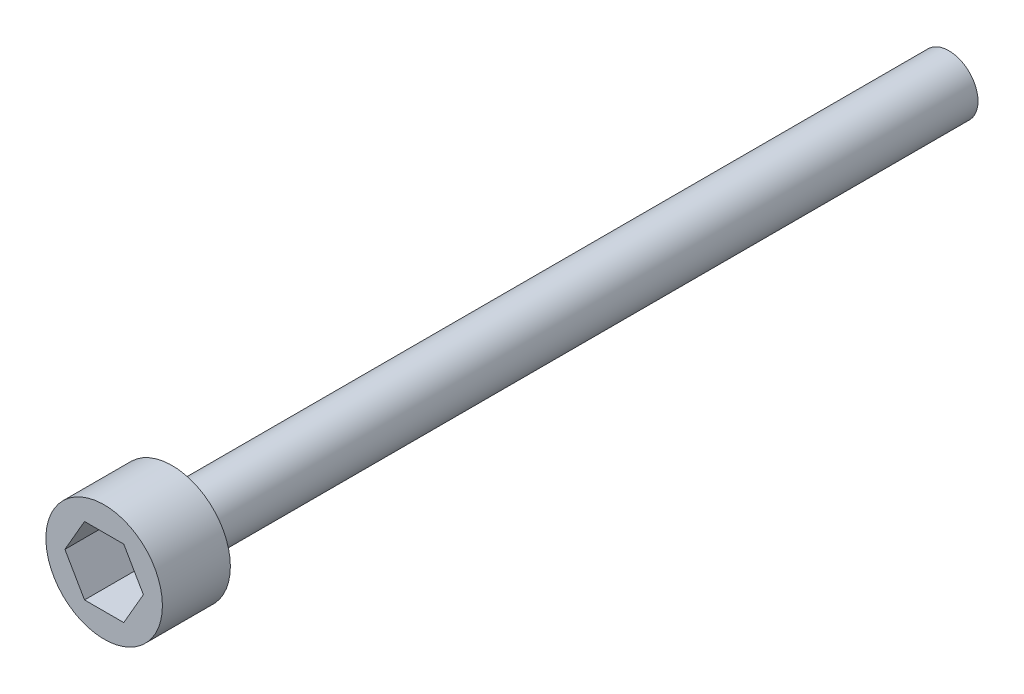
ISO-10303-21;
HEADER;
FILE_DESCRIPTION(('STEP AP214'),'2;1');
FILE_NAME('part.step','',(''),(''),'','','');
FILE_SCHEMA(('AUTOMOTIVE_DESIGN { 1 0 10303 214 1 1 1 1 }'));
ENDSEC;
DATA;
#1=APPLICATION_CONTEXT('core data for automotive mechanical design processes');
#2=APPLICATION_PROTOCOL_DEFINITION('international standard','automotive_design',2000,#1);
#3=PRODUCT_CONTEXT('',#1,'mechanical');
#4=PRODUCT('Part','Part','',(#3));
#5=PRODUCT_RELATED_PRODUCT_CATEGORY('part','',(#4));
#6=PRODUCT_DEFINITION_FORMATION('','',#4);
#7=PRODUCT_DEFINITION_CONTEXT('part definition',#1,'design');
#8=PRODUCT_DEFINITION('design','',#6,#7);
#9=PRODUCT_DEFINITION_SHAPE('','',#8);
#10=(LENGTH_UNIT() NAMED_UNIT(*) SI_UNIT(.MILLI.,.METRE.));
#11=(NAMED_UNIT(*) PLANE_ANGLE_UNIT() SI_UNIT($,.RADIAN.));
#12=(NAMED_UNIT(*) SI_UNIT($,.STERADIAN.) SOLID_ANGLE_UNIT());
#13=UNCERTAINTY_MEASURE_WITH_UNIT(LENGTH_MEASURE(1.E-05),#10,'distance_accuracy_value','');
#14=(GEOMETRIC_REPRESENTATION_CONTEXT(3) GLOBAL_UNCERTAINTY_ASSIGNED_CONTEXT((#13)) GLOBAL_UNIT_ASSIGNED_CONTEXT((#10,
#11,#12)) REPRESENTATION_CONTEXT('',''));
#15=CARTESIAN_POINT('',(0.,0.,0.));
#16=DIRECTION('',(0.,0.,1.));
#17=DIRECTION('',(1.,0.,0.));
#18=AXIS2_PLACEMENT_3D('',#15,#16,#17);
#19=CARTESIAN_POINT('',(0.,0.,3.5));
#20=DIRECTION('',(0.,0.,-1.));
#21=DIRECTION('',(-1.,0.,0.));
#22=AXIS2_PLACEMENT_3D('',#19,#20,#21);
#23=CYLINDRICAL_SURFACE('',#22,3.);
#24=CARTESIAN_POINT('',(0.,0.,3.5));
#25=DIRECTION('',(0.,0.,1.));
#26=DIRECTION('',(1.,0.,0.));
#27=AXIS2_PLACEMENT_3D('',#24,#25,#26);
#28=CIRCLE('',#27,3.);
#29=CARTESIAN_POINT('',(3.,0.,3.5));
#30=VERTEX_POINT('',#29);
#31=EDGE_CURVE('E11',#30,#30,#28,.T.);
#32=ORIENTED_EDGE('',*,*,#31,.F.);
#33=EDGE_LOOP('',(#32));
#34=FACE_BOUND('',#33,.T.);
#35=CARTESIAN_POINT('',(0.,0.,0.));
#36=DIRECTION('',(0.,0.,1.));
#37=DIRECTION('',(1.,0.,0.));
#38=AXIS2_PLACEMENT_3D('',#35,#36,#37);
#39=CIRCLE('',#38,3.);
#40=CARTESIAN_POINT('',(3.,0.,0.));
#41=VERTEX_POINT('',#40);
#42=EDGE_CURVE('E38',#41,#41,#39,.T.);
#43=ORIENTED_EDGE('',*,*,#42,.T.);
#44=EDGE_LOOP('',(#43));
#45=FACE_BOUND('',#44,.T.);
#46=ADVANCED_FACE('F35',(#34,#45),#23,.T.);
#47=CARTESIAN_POINT('',(0.,0.,3.5));
#48=DIRECTION('',(0.,0.,1.));
#49=DIRECTION('',(1.,0.,0.));
#50=AXIS2_PLACEMENT_3D('',#47,#48,#49);
#51=PLANE('',#50);
#52=DIRECTION('',(-0.499999999999528,-0.866025403784711,0.));
#53=VECTOR('',#52,1.);
#54=CARTESIAN_POINT('',(-2.02072594216261,2.1557411053031E-12,3.5));
#55=LINE('',#54,#53);
#56=CARTESIAN_POINT('',(-1.01036297108294,1.75000000000058,3.5));
#57=VERTEX_POINT('',#56);
#58=CARTESIAN_POINT('',(-2.02072594216261,2.15561075933568E-12,3.5));
#59=VERTEX_POINT('',#58);
#60=EDGE_CURVE('E49',#57,#59,#55,.T.);
#61=ORIENTED_EDGE('',*,*,#60,.F.);
#62=DIRECTION('',(-1.,-7.11024037944377E-13,0.));
#63=VECTOR('',#62,1.);
#64=CARTESIAN_POINT('',(-1.01036297108294,1.75000000000058,3.5));
#65=LINE('',#64,#63);
#66=CARTESIAN_POINT('',(1.01036297108301,1.75000000000202,3.5));
#67=VERTEX_POINT('',#66);
#68=EDGE_CURVE('E133',#67,#57,#65,.T.);
#69=ORIENTED_EDGE('',*,*,#68,.F.);
#70=DIRECTION('',(-0.50000000000043,0.86602540378419,0.));
#71=VECTOR('',#70,1.);
#72=CARTESIAN_POINT('',(1.01036297108301,1.75000000000202,3.5));
#73=LINE('',#72,#71);
#74=CARTESIAN_POINT('',(2.02072594216593,2.15574110530311E-12,3.5));
#75=VERTEX_POINT('',#74);
#76=EDGE_CURVE('E131',#75,#67,#73,.T.);
#77=ORIENTED_EDGE('',*,*,#76,.F.);
#78=DIRECTION('',(0.499999999999527,0.866025403784711,0.));
#79=VECTOR('',#78,1.);
#80=CARTESIAN_POINT('',(2.02072594216593,2.15574110530311E-12,3.5));
#81=LINE('',#80,#79);
#82=CARTESIAN_POINT('',(1.01036297108301,-1.75000000000192,3.5));
#83=VERTEX_POINT('',#82);
#84=EDGE_CURVE('E97',#83,#75,#81,.T.);
#85=ORIENTED_EDGE('',*,*,#84,.F.);
#86=DIRECTION('',(1.,7.11024037946673E-13,0.));
#87=VECTOR('',#86,1.);
#88=CARTESIAN_POINT('',(1.01036297108301,-1.75000000000192,3.5));
#89=LINE('',#88,#87);
#90=CARTESIAN_POINT('',(-1.01036297107642,-1.75000000000336,3.5));
#91=VERTEX_POINT('',#90);
#92=EDGE_CURVE('E127',#91,#83,#89,.T.);
#93=ORIENTED_EDGE('',*,*,#92,.F.);
#94=DIRECTION('',(0.500000000000431,-0.86602540378419,0.));
#95=VECTOR('',#94,1.);
#96=CARTESIAN_POINT('',(-1.01036297107642,-1.75000000000336,3.5));
#97=LINE('',#96,#95);
#98=EDGE_CURVE('E123',#59,#91,#97,.T.);
#99=ORIENTED_EDGE('',*,*,#98,.F.);
#100=EDGE_LOOP('',(#61,#69,#77,#85,#93,#99));
#101=FACE_BOUND('',#100,.T.);
#102=ORIENTED_EDGE('',*,*,#31,.T.);
#103=EDGE_LOOP('',(#102));
#104=FACE_BOUND('',#103,.T.);
#105=ADVANCED_FACE('F146',(#101,#104),#51,.T.);
#106=CARTESIAN_POINT('',(0.,0.,0.));
#107=DIRECTION('',(0.,0.,1.));
#108=DIRECTION('',(1.,0.,0.));
#109=AXIS2_PLACEMENT_3D('',#106,#107,#108);
#110=PLANE('',#109);
#111=CARTESIAN_POINT('',(0.,0.,0.));
#112=DIRECTION('',(0.,0.,1.));
#113=DIRECTION('',(1.,0.,0.));
#114=AXIS2_PLACEMENT_3D('',#111,#112,#113);
#115=CIRCLE('',#114,1.5);
#116=CARTESIAN_POINT('',(1.5,0.,0.));
#117=VERTEX_POINT('',#116);
#118=EDGE_CURVE('E153',#117,#117,#115,.T.);
#119=ORIENTED_EDGE('',*,*,#118,.T.);
#120=EDGE_LOOP('',(#119));
#121=FACE_BOUND('',#120,.T.);
#122=ORIENTED_EDGE('',*,*,#42,.F.);
#123=EDGE_LOOP('',(#122));
#124=FACE_BOUND('',#123,.T.);
#125=ADVANCED_FACE('F174',(#121,#124),#110,.F.);
#126=CARTESIAN_POINT('',(-2.02072594216261,2.1557411053031E-12,0.7));
#127=DIRECTION('',(-0.866025403784711,0.499999999999528,0.));
#128=DIRECTION('',(-0.499999999999528,-0.866025403784711,0.));
#129=AXIS2_PLACEMENT_3D('',#126,#127,#128);
#130=PLANE('',#129);
#131=ORIENTED_EDGE('',*,*,#60,.T.);
#132=DIRECTION('',(0.,0.,1.));
#133=VECTOR('',#132,1.);
#134=CARTESIAN_POINT('',(-2.02072594216261,2.1557411053031E-12,0.7));
#135=LINE('',#134,#133);
#136=CARTESIAN_POINT('',(-2.02072594216261,2.1557411053031E-12,0.7));
#137=VERTEX_POINT('',#136);
#138=EDGE_CURVE('E79',#137,#59,#135,.T.);
#139=ORIENTED_EDGE('',*,*,#138,.F.);
#140=DIRECTION('',(-0.499999999999528,-0.866025403784711,0.));
#141=VECTOR('',#140,1.);
#142=CARTESIAN_POINT('',(-2.02072594216261,2.1557411053031E-12,0.7));
#143=LINE('',#142,#141);
#144=CARTESIAN_POINT('',(-1.01036297108294,1.75000000000058,0.7));
#145=VERTEX_POINT('',#144);
#146=EDGE_CURVE('E135',#145,#137,#143,.T.);
#147=ORIENTED_EDGE('',*,*,#146,.F.);
#148=DIRECTION('',(0.,0.,1.));
#149=VECTOR('',#148,1.);
#150=CARTESIAN_POINT('',(-1.01036297108294,1.75000000000058,0.7));
#151=LINE('',#150,#149);
#152=EDGE_CURVE('E57',#145,#57,#151,.T.);
#153=ORIENTED_EDGE('',*,*,#152,.T.);
#154=EDGE_LOOP('',(#131,#139,#147,#153));
#155=FACE_BOUND('',#154,.T.);
#156=ADVANCED_FACE('F182',(#155),#130,.F.);
#157=CARTESIAN_POINT('',(-1.01036297108294,1.75000000000058,0.7));
#158=DIRECTION('',(-7.11024037944377E-13,1.,0.));
#159=DIRECTION('',(-1.,-7.11024037944377E-13,0.));
#160=AXIS2_PLACEMENT_3D('',#157,#158,#159);
#161=PLANE('',#160);
#162=ORIENTED_EDGE('',*,*,#68,.T.);
#163=ORIENTED_EDGE('',*,*,#152,.F.);
#164=DIRECTION('',(-1.,-7.11024037944377E-13,0.));
#165=VECTOR('',#164,1.);
#166=CARTESIAN_POINT('',(-1.01036297108294,1.75000000000058,0.7));
#167=LINE('',#166,#165);
#168=CARTESIAN_POINT('',(1.01036297108301,1.75000000000202,0.7));
#169=VERTEX_POINT('',#168);
#170=EDGE_CURVE('E109',#169,#145,#167,.T.);
#171=ORIENTED_EDGE('',*,*,#170,.F.);
#172=DIRECTION('',(0.,0.,1.));
#173=VECTOR('',#172,1.);
#174=CARTESIAN_POINT('',(1.01036297108301,1.75000000000202,0.7));
#175=LINE('',#174,#173);
#176=EDGE_CURVE('E101',#169,#67,#175,.T.);
#177=ORIENTED_EDGE('',*,*,#176,.T.);
#178=EDGE_LOOP('',(#162,#163,#171,#177));
#179=FACE_BOUND('',#178,.T.);
#180=ADVANCED_FACE('F187',(#179),#161,.F.);
#181=CARTESIAN_POINT('',(1.01036297108301,1.75000000000202,0.7));
#182=DIRECTION('',(0.86602540378419,0.50000000000043,0.));
#183=DIRECTION('',(-0.50000000000043,0.86602540378419,0.));
#184=AXIS2_PLACEMENT_3D('',#181,#182,#183);
#185=PLANE('',#184);
#186=ORIENTED_EDGE('',*,*,#76,.T.);
#187=ORIENTED_EDGE('',*,*,#176,.F.);
#188=DIRECTION('',(-0.50000000000043,0.86602540378419,0.));
#189=VECTOR('',#188,1.);
#190=CARTESIAN_POINT('',(1.01036297108301,1.75000000000202,0.7));
#191=LINE('',#190,#189);
#192=CARTESIAN_POINT('',(2.02072594216593,2.15574110530311E-12,0.7));
#193=VERTEX_POINT('',#192);
#194=EDGE_CURVE('E105',#193,#169,#191,.T.);
#195=ORIENTED_EDGE('',*,*,#194,.F.);
#196=DIRECTION('',(0.,0.,1.));
#197=VECTOR('',#196,1.);
#198=CARTESIAN_POINT('',(2.02072594216593,2.15574110530311E-12,0.7));
#199=LINE('',#198,#197);
#200=EDGE_CURVE('E90',#193,#75,#199,.T.);
#201=ORIENTED_EDGE('',*,*,#200,.T.);
#202=EDGE_LOOP('',(#186,#187,#195,#201));
#203=FACE_BOUND('',#202,.T.);
#204=ADVANCED_FACE('F106',(#203),#185,.F.);
#205=CARTESIAN_POINT('',(2.02072594216593,2.15574110530311E-12,0.7));
#206=DIRECTION('',(0.866025403784712,-0.499999999999527,0.));
#207=DIRECTION('',(0.499999999999527,0.866025403784712,0.));
#208=AXIS2_PLACEMENT_3D('',#205,#206,#207);
#209=PLANE('',#208);
#210=ORIENTED_EDGE('',*,*,#84,.T.);
#211=ORIENTED_EDGE('',*,*,#200,.F.);
#212=DIRECTION('',(0.499999999999527,0.866025403784711,0.));
#213=VECTOR('',#212,1.);
#214=CARTESIAN_POINT('',(2.02072594216593,2.15574110530311E-12,0.7));
#215=LINE('',#214,#213);
#216=CARTESIAN_POINT('',(1.01036297108301,-1.75000000000192,0.7));
#217=VERTEX_POINT('',#216);
#218=EDGE_CURVE('E94',#217,#193,#215,.T.);
#219=ORIENTED_EDGE('',*,*,#218,.F.);
#220=DIRECTION('',(0.,0.,1.));
#221=VECTOR('',#220,1.);
#222=CARTESIAN_POINT('',(1.01036297108301,-1.75000000000192,0.7));
#223=LINE('',#222,#221);
#224=EDGE_CURVE('E102',#217,#83,#223,.T.);
#225=ORIENTED_EDGE('',*,*,#224,.T.);
#226=EDGE_LOOP('',(#210,#211,#219,#225));
#227=FACE_BOUND('',#226,.T.);
#228=ADVANCED_FACE('F92',(#227),#209,.F.);
#229=CARTESIAN_POINT('',(1.01036297108301,-1.75000000000192,0.7));
#230=DIRECTION('',(7.11024037946673E-13,-1.,0.));
#231=DIRECTION('',(1.,7.11024037946673E-13,0.));
#232=AXIS2_PLACEMENT_3D('',#229,#230,#231);
#233=PLANE('',#232);
#234=ORIENTED_EDGE('',*,*,#92,.T.);
#235=ORIENTED_EDGE('',*,*,#224,.F.);
#236=DIRECTION('',(1.,7.11024037946673E-13,0.));
#237=VECTOR('',#236,1.);
#238=CARTESIAN_POINT('',(1.01036297108301,-1.75000000000192,0.7));
#239=LINE('',#238,#237);
#240=CARTESIAN_POINT('',(-1.01036297107642,-1.75000000000336,0.7));
#241=VERTEX_POINT('',#240);
#242=EDGE_CURVE('E115',#241,#217,#239,.T.);
#243=ORIENTED_EDGE('',*,*,#242,.F.);
#244=DIRECTION('',(0.,0.,1.));
#245=VECTOR('',#244,1.);
#246=CARTESIAN_POINT('',(-1.01036297107642,-1.75000000000336,0.7));
#247=LINE('',#246,#245);
#248=EDGE_CURVE('E139',#241,#91,#247,.T.);
#249=ORIENTED_EDGE('',*,*,#248,.T.);
#250=EDGE_LOOP('',(#234,#235,#243,#249));
#251=FACE_BOUND('',#250,.T.);
#252=ADVANCED_FACE('F150',(#251),#233,.F.);
#253=CARTESIAN_POINT('',(-1.01036297107642,-1.75000000000336,0.7));
#254=DIRECTION('',(-0.86602540378419,-0.500000000000431,0.));
#255=DIRECTION('',(0.500000000000431,-0.86602540378419,0.));
#256=AXIS2_PLACEMENT_3D('',#253,#254,#255);
#257=PLANE('',#256);
#258=ORIENTED_EDGE('',*,*,#98,.T.);
#259=ORIENTED_EDGE('',*,*,#248,.F.);
#260=DIRECTION('',(0.500000000000431,-0.86602540378419,0.));
#261=VECTOR('',#260,1.);
#262=CARTESIAN_POINT('',(-1.01036297107642,-1.75000000000336,0.7));
#263=LINE('',#262,#261);
#264=EDGE_CURVE('E117',#137,#241,#263,.T.);
#265=ORIENTED_EDGE('',*,*,#264,.F.);
#266=ORIENTED_EDGE('',*,*,#138,.T.);
#267=EDGE_LOOP('',(#258,#259,#265,#266));
#268=FACE_BOUND('',#267,.T.);
#269=ADVANCED_FACE('F143',(#268),#257,.F.);
#270=CARTESIAN_POINT('',(-1.01036297108294,1.75000000000058,0.7));
#271=DIRECTION('',(0.,0.,-1.));
#272=DIRECTION('',(-1.,0.,0.));
#273=AXIS2_PLACEMENT_3D('',#270,#271,#272);
#274=PLANE('',#273);
#275=ORIENTED_EDGE('',*,*,#146,.T.);
#276=ORIENTED_EDGE('',*,*,#264,.T.);
#277=ORIENTED_EDGE('',*,*,#242,.T.);
#278=ORIENTED_EDGE('',*,*,#218,.T.);
#279=ORIENTED_EDGE('',*,*,#194,.T.);
#280=ORIENTED_EDGE('',*,*,#170,.T.);
#281=EDGE_LOOP('',(#275,#276,#277,#278,#279,#280));
#282=FACE_BOUND('',#281,.T.);
#283=ADVANCED_FACE('F112',(#282),#274,.F.);
#284=CARTESIAN_POINT('',(0.,0.,-40.));
#285=DIRECTION('',(0.,0.,1.));
#286=DIRECTION('',(1.,0.,0.));
#287=AXIS2_PLACEMENT_3D('',#284,#285,#286);
#288=CYLINDRICAL_SURFACE('',#287,1.5);
#289=CARTESIAN_POINT('',(0.,0.,-40.));
#290=DIRECTION('',(0.,0.,1.));
#291=DIRECTION('',(1.,0.,0.));
#292=AXIS2_PLACEMENT_3D('',#289,#290,#291);
#293=CIRCLE('',#292,1.5);
#294=CARTESIAN_POINT('',(1.5,0.,-40.));
#295=VERTEX_POINT('',#294);
#296=EDGE_CURVE('E124',#295,#295,#293,.T.);
#297=ORIENTED_EDGE('',*,*,#296,.T.);
#298=EDGE_LOOP('',(#297));
#299=FACE_BOUND('',#298,.T.);
#300=ORIENTED_EDGE('',*,*,#118,.F.);
#301=EDGE_LOOP('',(#300));
#302=FACE_BOUND('',#301,.T.);
#303=ADVANCED_FACE('F159',(#299,#302),#288,.T.);
#304=CARTESIAN_POINT('',(0.,0.,-40.));
#305=DIRECTION('',(0.,0.,1.));
#306=DIRECTION('',(1.,0.,0.));
#307=AXIS2_PLACEMENT_3D('',#304,#305,#306);
#308=PLANE('',#307);
#309=ORIENTED_EDGE('',*,*,#296,.F.);
#310=EDGE_LOOP('',(#309));
#311=FACE_BOUND('',#310,.T.);
#312=ADVANCED_FACE('F162',(#311),#308,.F.);
#313=CLOSED_SHELL('',(#46,#105,#125,#156,#180,#204,#228,#252,#269,#283,#303,#312));
#314=MANIFOLD_SOLID_BREP('B2',#313);
#315=ADVANCED_BREP_SHAPE_REPRESENTATION('',(#18,#314),#14);
#316=SHAPE_DEFINITION_REPRESENTATION(#9,#315);
ENDSEC;
END-ISO-10303-21;
